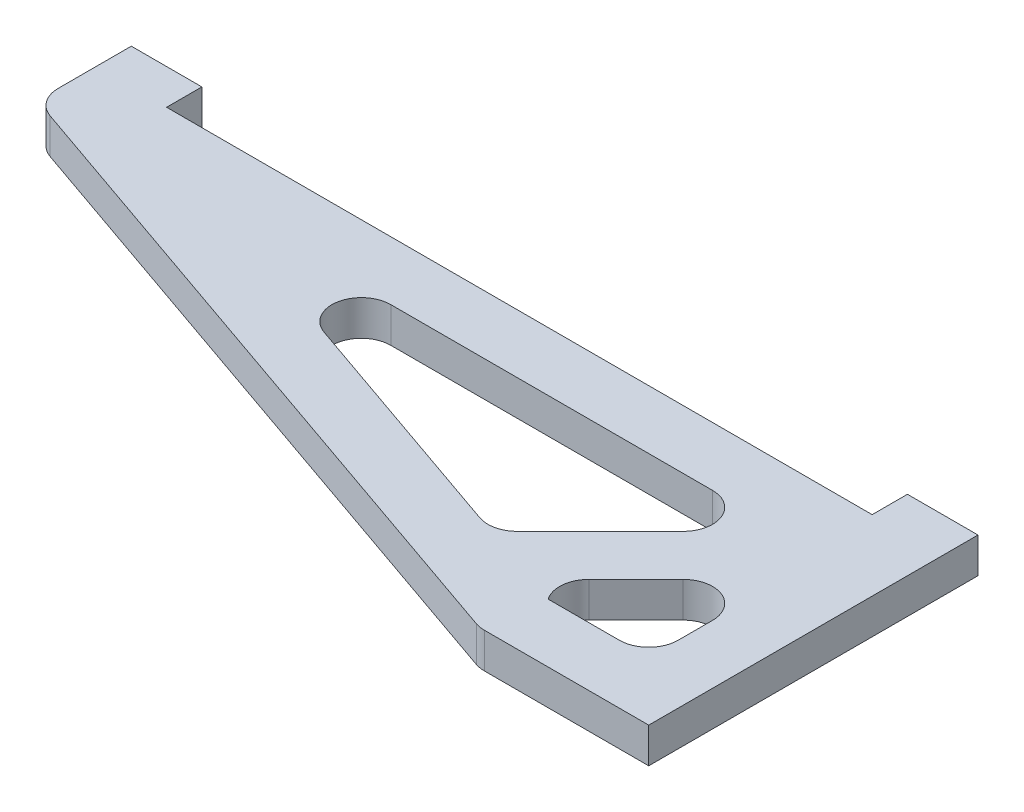
ISO-10303-21;
HEADER;
FILE_DESCRIPTION(('STEP AP214'),'2;1');
FILE_NAME('part.step','',(''),(''),'','','');
FILE_SCHEMA(('AUTOMOTIVE_DESIGN { 1 0 10303 214 1 1 1 1 }'));
ENDSEC;
DATA;
#1=APPLICATION_CONTEXT('core data for automotive mechanical design processes');
#2=APPLICATION_PROTOCOL_DEFINITION('international standard','automotive_design',2000,#1);
#3=PRODUCT_CONTEXT('',#1,'mechanical');
#4=PRODUCT('Part','Part','',(#3));
#5=PRODUCT_RELATED_PRODUCT_CATEGORY('part','',(#4));
#6=PRODUCT_DEFINITION_FORMATION('','',#4);
#7=PRODUCT_DEFINITION_CONTEXT('part definition',#1,'design');
#8=PRODUCT_DEFINITION('design','',#6,#7);
#9=PRODUCT_DEFINITION_SHAPE('','',#8);
#10=(LENGTH_UNIT() NAMED_UNIT(*) SI_UNIT(.MILLI.,.METRE.));
#11=(NAMED_UNIT(*) PLANE_ANGLE_UNIT() SI_UNIT($,.RADIAN.));
#12=(NAMED_UNIT(*) SI_UNIT($,.STERADIAN.) SOLID_ANGLE_UNIT());
#13=UNCERTAINTY_MEASURE_WITH_UNIT(LENGTH_MEASURE(1.E-05),#10,'distance_accuracy_value','');
#14=(GEOMETRIC_REPRESENTATION_CONTEXT(3) GLOBAL_UNCERTAINTY_ASSIGNED_CONTEXT((#13)) GLOBAL_UNIT_ASSIGNED_CONTEXT((#10,
#11,#12)) REPRESENTATION_CONTEXT('',''));
#15=CARTESIAN_POINT('',(0.,0.,0.));
#16=DIRECTION('',(0.,0.,1.));
#17=DIRECTION('',(1.,0.,0.));
#18=AXIS2_PLACEMENT_3D('',#15,#16,#17);
#19=CARTESIAN_POINT('',(36.,3.,0.));
#20=DIRECTION('',(1.,0.,0.));
#21=DIRECTION('',(0.,0.,-1.));
#22=AXIS2_PLACEMENT_3D('',#19,#20,#21);
#23=PLANE('',#22);
#24=DIRECTION('',(0.,0.,1.));
#25=VECTOR('',#24,1.);
#26=CARTESIAN_POINT('',(36.,0.,0.));
#27=LINE('',#26,#25);
#28=CARTESIAN_POINT('',(36.,0.,-15.5));
#29=VERTEX_POINT('',#28);
#30=CARTESIAN_POINT('',(36.,0.,12.5));
#31=VERTEX_POINT('',#30);
#32=EDGE_CURVE('E278',#29,#31,#27,.T.);
#33=ORIENTED_EDGE('',*,*,#32,.F.);
#34=DIRECTION('',(0.,-1.,0.));
#35=VECTOR('',#34,1.);
#36=CARTESIAN_POINT('',(36.,3.,-15.5));
#37=LINE('',#36,#35);
#38=CARTESIAN_POINT('',(36.,3.,-15.5));
#39=VERTEX_POINT('',#38);
#40=EDGE_CURVE('E364',#39,#29,#37,.T.);
#41=ORIENTED_EDGE('',*,*,#40,.F.);
#42=DIRECTION('',(0.,0.,1.));
#43=VECTOR('',#42,1.);
#44=CARTESIAN_POINT('',(36.,3.,0.));
#45=LINE('',#44,#43);
#46=CARTESIAN_POINT('',(36.,3.,12.5));
#47=VERTEX_POINT('',#46);
#48=EDGE_CURVE('E279',#39,#47,#45,.T.);
#49=ORIENTED_EDGE('',*,*,#48,.T.);
#50=DIRECTION('',(0.,-1.,0.));
#51=VECTOR('',#50,1.);
#52=CARTESIAN_POINT('',(36.,3.,12.5));
#53=LINE('',#52,#51);
#54=EDGE_CURVE('E312',#47,#31,#53,.T.);
#55=ORIENTED_EDGE('',*,*,#54,.T.);
#56=EDGE_LOOP('',(#33,#41,#49,#55));
#57=FACE_BOUND('',#56,.T.);
#58=ADVANCED_FACE('F62',(#57),#23,.T.);
#59=CARTESIAN_POINT('',(0.,3.,-15.5));
#60=DIRECTION('',(0.,0.,1.));
#61=DIRECTION('',(1.,0.,0.));
#62=AXIS2_PLACEMENT_3D('',#59,#60,#61);
#63=PLANE('',#62);
#64=DIRECTION('',(-1.,0.,0.));
#65=VECTOR('',#64,1.);
#66=CARTESIAN_POINT('',(0.,0.,-15.5));
#67=LINE('',#66,#65);
#68=CARTESIAN_POINT('',(30.,0.,-15.5));
#69=VERTEX_POINT('',#68);
#70=EDGE_CURVE('E316',#29,#69,#67,.T.);
#71=ORIENTED_EDGE('',*,*,#70,.T.);
#72=DIRECTION('',(0.,-1.,0.));
#73=VECTOR('',#72,1.);
#74=CARTESIAN_POINT('',(30.,3.,-15.5));
#75=LINE('',#74,#73);
#76=CARTESIAN_POINT('',(30.,3.,-15.5));
#77=VERTEX_POINT('',#76);
#78=EDGE_CURVE('E361',#77,#69,#75,.T.);
#79=ORIENTED_EDGE('',*,*,#78,.F.);
#80=DIRECTION('',(-1.,0.,0.));
#81=VECTOR('',#80,1.);
#82=CARTESIAN_POINT('',(0.,3.,-15.5));
#83=LINE('',#82,#81);
#84=EDGE_CURVE('E283',#39,#77,#83,.T.);
#85=ORIENTED_EDGE('',*,*,#84,.F.);
#86=ORIENTED_EDGE('',*,*,#40,.T.);
#87=EDGE_LOOP('',(#71,#79,#85,#86));
#88=FACE_BOUND('',#87,.T.);
#89=ADVANCED_FACE('F487',(#88),#63,.F.);
#90=CARTESIAN_POINT('',(30.,3.,0.));
#91=DIRECTION('',(-1.,0.,0.));
#92=DIRECTION('',(0.,0.,1.));
#93=AXIS2_PLACEMENT_3D('',#90,#91,#92);
#94=PLANE('',#93);
#95=DIRECTION('',(0.,0.,-1.));
#96=VECTOR('',#95,1.);
#97=CARTESIAN_POINT('',(30.,0.,0.));
#98=LINE('',#97,#96);
#99=CARTESIAN_POINT('',(30.,0.,-12.5));
#100=VERTEX_POINT('',#99);
#101=EDGE_CURVE('E320',#100,#69,#98,.T.);
#102=ORIENTED_EDGE('',*,*,#101,.F.);
#103=DIRECTION('',(0.,-1.,0.));
#104=VECTOR('',#103,1.);
#105=CARTESIAN_POINT('',(30.,3.,-12.5));
#106=LINE('',#105,#104);
#107=CARTESIAN_POINT('',(30.,3.,-12.5));
#108=VERTEX_POINT('',#107);
#109=EDGE_CURVE('E358',#108,#100,#106,.T.);
#110=ORIENTED_EDGE('',*,*,#109,.F.);
#111=DIRECTION('',(0.,0.,-1.));
#112=VECTOR('',#111,1.);
#113=CARTESIAN_POINT('',(30.,3.,0.));
#114=LINE('',#113,#112);
#115=EDGE_CURVE('E287',#108,#77,#114,.T.);
#116=ORIENTED_EDGE('',*,*,#115,.T.);
#117=ORIENTED_EDGE('',*,*,#78,.T.);
#118=EDGE_LOOP('',(#102,#110,#116,#117));
#119=FACE_BOUND('',#118,.T.);
#120=ADVANCED_FACE('F493',(#119),#94,.T.);
#121=CARTESIAN_POINT('',(0.,3.,-12.5));
#122=DIRECTION('',(0.,0.,-1.));
#123=DIRECTION('',(-1.,0.,0.));
#124=AXIS2_PLACEMENT_3D('',#121,#122,#123);
#125=PLANE('',#124);
#126=DIRECTION('',(1.,0.,0.));
#127=VECTOR('',#126,1.);
#128=CARTESIAN_POINT('',(0.,0.,-12.5));
#129=LINE('',#128,#127);
#130=CARTESIAN_POINT('',(-30.,0.,-12.5));
#131=VERTEX_POINT('',#130);
#132=EDGE_CURVE('E324',#131,#100,#129,.T.);
#133=ORIENTED_EDGE('',*,*,#132,.F.);
#134=DIRECTION('',(0.,-1.,0.));
#135=VECTOR('',#134,1.);
#136=CARTESIAN_POINT('',(-30.,3.,-12.5));
#137=LINE('',#136,#135);
#138=CARTESIAN_POINT('',(-30.,3.,-12.5));
#139=VERTEX_POINT('',#138);
#140=EDGE_CURVE('E355',#139,#131,#137,.T.);
#141=ORIENTED_EDGE('',*,*,#140,.F.);
#142=DIRECTION('',(1.,0.,0.));
#143=VECTOR('',#142,1.);
#144=CARTESIAN_POINT('',(0.,3.,-12.5));
#145=LINE('',#144,#143);
#146=EDGE_CURVE('E291',#139,#108,#145,.T.);
#147=ORIENTED_EDGE('',*,*,#146,.T.);
#148=ORIENTED_EDGE('',*,*,#109,.T.);
#149=EDGE_LOOP('',(#133,#141,#147,#148));
#150=FACE_BOUND('',#149,.T.);
#151=ADVANCED_FACE('F568',(#150),#125,.T.);
#152=CARTESIAN_POINT('',(-30.,3.,0.));
#153=DIRECTION('',(-1.,0.,0.));
#154=DIRECTION('',(0.,0.,1.));
#155=AXIS2_PLACEMENT_3D('',#152,#153,#154);
#156=PLANE('',#155);
#157=DIRECTION('',(0.,0.,-1.));
#158=VECTOR('',#157,1.);
#159=CARTESIAN_POINT('',(-30.,0.,0.));
#160=LINE('',#159,#158);
#161=CARTESIAN_POINT('',(-30.,0.,-15.5));
#162=VERTEX_POINT('',#161);
#163=EDGE_CURVE('E328',#131,#162,#160,.T.);
#164=ORIENTED_EDGE('',*,*,#163,.T.);
#165=DIRECTION('',(0.,-1.,0.));
#166=VECTOR('',#165,1.);
#167=CARTESIAN_POINT('',(-30.,3.,-15.5));
#168=LINE('',#167,#166);
#169=CARTESIAN_POINT('',(-30.,3.,-15.5));
#170=VERTEX_POINT('',#169);
#171=EDGE_CURVE('E352',#170,#162,#168,.T.);
#172=ORIENTED_EDGE('',*,*,#171,.F.);
#173=DIRECTION('',(0.,0.,-1.));
#174=VECTOR('',#173,1.);
#175=CARTESIAN_POINT('',(-30.,3.,0.));
#176=LINE('',#175,#174);
#177=EDGE_CURVE('E295',#139,#170,#176,.T.);
#178=ORIENTED_EDGE('',*,*,#177,.F.);
#179=ORIENTED_EDGE('',*,*,#140,.T.);
#180=EDGE_LOOP('',(#164,#172,#178,#179));
#181=FACE_BOUND('',#180,.T.);
#182=ADVANCED_FACE('F564',(#181),#156,.F.);
#183=CARTESIAN_POINT('',(0.,3.,-15.5));
#184=DIRECTION('',(0.,0.,-1.));
#185=DIRECTION('',(-1.,0.,0.));
#186=AXIS2_PLACEMENT_3D('',#183,#184,#185);
#187=PLANE('',#186);
#188=DIRECTION('',(1.,0.,0.));
#189=VECTOR('',#188,1.);
#190=CARTESIAN_POINT('',(0.,0.,-15.5));
#191=LINE('',#190,#189);
#192=CARTESIAN_POINT('',(-36.,0.,-15.5));
#193=VERTEX_POINT('',#192);
#194=EDGE_CURVE('E332',#193,#162,#191,.T.);
#195=ORIENTED_EDGE('',*,*,#194,.F.);
#196=DIRECTION('',(0.,-1.,0.));
#197=VECTOR('',#196,1.);
#198=CARTESIAN_POINT('',(-36.,3.,-15.5));
#199=LINE('',#198,#197);
#200=CARTESIAN_POINT('',(-36.,3.,-15.5));
#201=VERTEX_POINT('',#200);
#202=EDGE_CURVE('E349',#201,#193,#199,.T.);
#203=ORIENTED_EDGE('',*,*,#202,.F.);
#204=DIRECTION('',(1.,0.,0.));
#205=VECTOR('',#204,1.);
#206=CARTESIAN_POINT('',(0.,3.,-15.5));
#207=LINE('',#206,#205);
#208=EDGE_CURVE('E298',#201,#170,#207,.T.);
#209=ORIENTED_EDGE('',*,*,#208,.T.);
#210=ORIENTED_EDGE('',*,*,#171,.T.);
#211=EDGE_LOOP('',(#195,#203,#209,#210));
#212=FACE_BOUND('',#211,.T.);
#213=ADVANCED_FACE('F560',(#212),#187,.T.);
#214=CARTESIAN_POINT('',(-36.,3.,0.));
#215=DIRECTION('',(1.,0.,0.));
#216=DIRECTION('',(0.,0.,-1.));
#217=AXIS2_PLACEMENT_3D('',#214,#215,#216);
#218=PLANE('',#217);
#219=DIRECTION('',(0.,0.,1.));
#220=VECTOR('',#219,1.);
#221=CARTESIAN_POINT('',(-36.,0.,0.));
#222=LINE('',#221,#220);
#223=CARTESIAN_POINT('',(-36.,0.,-9.27836097392933));
#224=VERTEX_POINT('',#223);
#225=EDGE_CURVE('E336',#193,#224,#222,.T.);
#226=ORIENTED_EDGE('',*,*,#225,.T.);
#227=DIRECTION('',(0.,-1.,0.));
#228=VECTOR('',#227,1.);
#229=CARTESIAN_POINT('',(-36.,3.,-9.27836097392933));
#230=LINE('',#229,#228);
#231=CARTESIAN_POINT('',(-36.,3.,-9.27836097392933));
#232=VERTEX_POINT('',#231);
#233=EDGE_CURVE('E380',#224,#232,#230,.F.);
#234=ORIENTED_EDGE('',*,*,#233,.T.);
#235=DIRECTION('',(0.,0.,1.));
#236=VECTOR('',#235,1.);
#237=CARTESIAN_POINT('',(-36.,3.,0.));
#238=LINE('',#237,#236);
#239=EDGE_CURVE('E302',#201,#232,#238,.T.);
#240=ORIENTED_EDGE('',*,*,#239,.F.);
#241=ORIENTED_EDGE('',*,*,#202,.T.);
#242=EDGE_LOOP('',(#226,#234,#240,#241));
#243=FACE_BOUND('',#242,.T.);
#244=ADVANCED_FACE('F556',(#243),#218,.F.);
#245=CARTESIAN_POINT('',(-1.5493200206576,3.,4.46204165949389));
#246=DIRECTION('',(0.328011688970412,0.,-0.944673664234786));
#247=DIRECTION('',(-0.944673664234786,0.,-0.328011688970412));
#248=AXIS2_PLACEMENT_3D('',#245,#246,#247);
#249=PLANE('',#248);
#250=DIRECTION('',(0.944673664234786,0.,0.328011688970412));
#251=VECTOR('',#250,1.);
#252=CARTESIAN_POINT('',(-1.5493200206576,3.,4.46204165949389));
#253=LINE('',#252,#251);
#254=CARTESIAN_POINT('',(-34.320029222426,3.,-6.91667681334237));
#255=VERTEX_POINT('',#254);
#256=CARTESIAN_POINT('',(21.2016503824904,3.,12.361684160587));
#257=VERTEX_POINT('',#256);
#258=EDGE_CURVE('E306',#255,#257,#253,.T.);
#259=ORIENTED_EDGE('',*,*,#258,.F.);
#260=DIRECTION('',(0.,-1.,0.));
#261=VECTOR('',#260,1.);
#262=CARTESIAN_POINT('',(-34.320029222426,3.,-6.91667681334237));
#263=LINE('',#262,#261);
#264=CARTESIAN_POINT('',(-34.320029222426,0.,-6.91667681334237));
#265=VERTEX_POINT('',#264);
#266=EDGE_CURVE('E370',#255,#265,#263,.T.);
#267=ORIENTED_EDGE('',*,*,#266,.T.);
#268=DIRECTION('',(0.944673664234786,0.,0.328011688970412));
#269=VECTOR('',#268,1.);
#270=CARTESIAN_POINT('',(-1.5493200206576,0.,4.46204165949389));
#271=LINE('',#270,#269);
#272=CARTESIAN_POINT('',(21.2016503824904,0.,12.361684160587));
#273=VERTEX_POINT('',#272);
#274=EDGE_CURVE('E340',#265,#273,#271,.T.);
#275=ORIENTED_EDGE('',*,*,#274,.T.);
#276=DIRECTION('',(0.,-1.,0.));
#277=VECTOR('',#276,1.);
#278=CARTESIAN_POINT('',(21.2016503824904,3.,12.361684160587));
#279=LINE('',#278,#277);
#280=EDGE_CURVE('E367',#273,#257,#279,.F.);
#281=ORIENTED_EDGE('',*,*,#280,.T.);
#282=EDGE_LOOP('',(#259,#267,#275,#281));
#283=FACE_BOUND('',#282,.T.);
#284=ADVANCED_FACE('F548',(#283),#249,.F.);
#285=CARTESIAN_POINT('',(0.,3.,12.5));
#286=DIRECTION('',(0.,0.,-1.));
#287=DIRECTION('',(-1.,0.,0.));
#288=AXIS2_PLACEMENT_3D('',#285,#286,#287);
#289=PLANE('',#288);
#290=DIRECTION('',(1.,0.,0.));
#291=VECTOR('',#290,1.);
#292=CARTESIAN_POINT('',(0.,3.,12.5));
#293=LINE('',#292,#291);
#294=CARTESIAN_POINT('',(22.0216796049165,3.,12.5));
#295=VERTEX_POINT('',#294);
#296=EDGE_CURVE('E309',#295,#47,#293,.T.);
#297=ORIENTED_EDGE('',*,*,#296,.F.);
#298=DIRECTION('',(0.,-1.,0.));
#299=VECTOR('',#298,1.);
#300=CARTESIAN_POINT('',(22.0216796049165,3.,12.5));
#301=LINE('',#300,#299);
#302=CARTESIAN_POINT('',(22.0216796049165,0.,12.5));
#303=VERTEX_POINT('',#302);
#304=EDGE_CURVE('E388',#295,#303,#301,.T.);
#305=ORIENTED_EDGE('',*,*,#304,.T.);
#306=DIRECTION('',(1.,0.,0.));
#307=VECTOR('',#306,1.);
#308=CARTESIAN_POINT('',(0.,0.,12.5));
#309=LINE('',#308,#307);
#310=EDGE_CURVE('E284',#303,#31,#309,.T.);
#311=ORIENTED_EDGE('',*,*,#310,.T.);
#312=ORIENTED_EDGE('',*,*,#54,.F.);
#313=EDGE_LOOP('',(#297,#305,#311,#312));
#314=FACE_BOUND('',#313,.T.);
#315=ADVANCED_FACE('F541',(#314),#289,.F.);
#316=CARTESIAN_POINT('',(0.,3.,0.));
#317=DIRECTION('',(0.,1.,0.));
#318=DIRECTION('',(0.,0.,1.));
#319=AXIS2_PLACEMENT_3D('',#316,#317,#318);
#320=PLANE('',#319);
#321=DIRECTION('',(1.,0.,0.));
#322=VECTOR('',#321,1.);
#323=CARTESIAN_POINT('',(0.,3.,7.50000000000001));
#324=LINE('',#323,#322);
#325=CARTESIAN_POINT('',(22.443359209833,3.,7.50000000000001));
#326=VERTEX_POINT('',#325);
#327=CARTESIAN_POINT('',(28.5,3.,7.50000000000001));
#328=VERTEX_POINT('',#327);
#329=EDGE_CURVE('E530',#326,#328,#324,.T.);
#330=ORIENTED_EDGE('',*,*,#329,.F.);
#331=CARTESIAN_POINT('',(24.4968960904406,3.,6.07417172142494));
#332=DIRECTION('',(0.,1.,0.));
#333=DIRECTION('',(0.,0.,1.));
#334=AXIS2_PLACEMENT_3D('',#331,#332,#333);
#335=CIRCLE('',#334,2.5);
#336=CARTESIAN_POINT('',(22.7291291374742,3.,4.30640476845857));
#337=VERTEX_POINT('',#336);
#338=EDGE_CURVE('E233',#326,#337,#335,.F.);
#339=ORIENTED_EDGE('',*,*,#338,.T.);
#340=DIRECTION('',(-0.707106781186546,0.,0.707106781186549));
#341=VECTOR('',#340,1.);
#342=CARTESIAN_POINT('',(13.5177669529664,3.,13.5177669529664));
#343=LINE('',#342,#341);
#344=CARTESIAN_POINT('',(26.7322330470336,3.,0.30330085889912));
#345=VERTEX_POINT('',#344);
#346=EDGE_CURVE('E248',#345,#337,#343,.T.);
#347=ORIENTED_EDGE('',*,*,#346,.F.);
#348=CARTESIAN_POINT('',(28.5,3.,2.07106781186548));
#349=DIRECTION('',(0.,1.,0.));
#350=DIRECTION('',(0.,0.,1.));
#351=AXIS2_PLACEMENT_3D('',#348,#349,#350);
#352=CIRCLE('',#351,2.5);
#353=CARTESIAN_POINT('',(31.,3.,2.07106781186548));
#354=VERTEX_POINT('',#353);
#355=EDGE_CURVE('E232',#345,#354,#352,.F.);
#356=ORIENTED_EDGE('',*,*,#355,.T.);
#357=DIRECTION('',(0.,0.,-1.));
#358=VECTOR('',#357,1.);
#359=CARTESIAN_POINT('',(31.,3.,0.));
#360=LINE('',#359,#358);
#361=CARTESIAN_POINT('',(31.,3.,5.00000000000001));
#362=VERTEX_POINT('',#361);
#363=EDGE_CURVE('E252',#362,#354,#360,.T.);
#364=ORIENTED_EDGE('',*,*,#363,.F.);
#365=CARTESIAN_POINT('',(28.5,3.,5.00000000000001));
#366=DIRECTION('',(0.,1.,0.));
#367=DIRECTION('',(0.,0.,1.));
#368=AXIS2_PLACEMENT_3D('',#365,#366,#367);
#369=CIRCLE('',#368,2.5);
#370=EDGE_CURVE('E436',#362,#328,#369,.F.);
#371=ORIENTED_EDGE('',*,*,#370,.T.);
#372=EDGE_LOOP('',(#330,#339,#347,#356,#364,#371));
#373=FACE_BOUND('',#372,.T.);
#374=DIRECTION('',(-1.,0.,0.));
#375=VECTOR('',#374,1.);
#376=CARTESIAN_POINT('',(0.,3.,-7.49999999999999));
#377=LINE('',#376,#375);
#378=CARTESIAN_POINT('',(21.4289321881346,3.,-7.5));
#379=VERTEX_POINT('',#378);
#380=CARTESIAN_POINT('',(-5.93496118525049,3.,-7.49999999999999));
#381=VERTEX_POINT('',#380);
#382=EDGE_CURVE('E263',#379,#381,#377,.T.);
#383=ORIENTED_EDGE('',*,*,#382,.F.);
#384=CARTESIAN_POINT('',(21.4289321881346,3.,-5.));
#385=DIRECTION('',(0.,1.,0.));
#386=DIRECTION('',(0.,0.,1.));
#387=AXIS2_PLACEMENT_3D('',#384,#385,#386);
#388=CIRCLE('',#387,2.5);
#389=CARTESIAN_POINT('',(23.1966991411009,3.,-3.23223304703363));
#390=VERTEX_POINT('',#389);
#391=EDGE_CURVE('E447',#379,#390,#388,.F.);
#392=ORIENTED_EDGE('',*,*,#391,.T.);
#393=DIRECTION('',(0.707106781186546,0.,-0.707106781186549));
#394=VECTOR('',#393,1.);
#395=CARTESIAN_POINT('',(9.98223304703371,3.,9.98223304703366));
#396=LINE('',#395,#394);
#397=CARTESIAN_POINT('',(16.1441493025996,3.,3.82031679146769));
#398=VERTEX_POINT('',#397);
#399=EDGE_CURVE('E270',#398,#390,#396,.T.);
#400=ORIENTED_EDGE('',*,*,#399,.F.);
#401=CARTESIAN_POINT('',(14.3763823496333,3.,2.05254983850133));
#402=DIRECTION('',(0.,1.,0.));
#403=DIRECTION('',(0.,0.,1.));
#404=AXIS2_PLACEMENT_3D('',#401,#402,#403);
#405=CIRCLE('',#404,2.5);
#406=CARTESIAN_POINT('',(13.5563531272072,3.,4.41423399908829));
#407=VERTEX_POINT('',#406);
#408=EDGE_CURVE('E86',#398,#407,#405,.F.);
#409=ORIENTED_EDGE('',*,*,#408,.T.);
#410=DIRECTION('',(0.944673664234786,0.,0.328011688970412));
#411=VECTOR('',#410,1.);
#412=CARTESIAN_POINT('',(0.0907384241944594,3.,-0.261326661680043));
#413=LINE('',#412,#411);
#414=CARTESIAN_POINT('',(-6.75499040767652,3.,-2.63831583941303));
#415=VERTEX_POINT('',#414);
#416=EDGE_CURVE('E267',#415,#407,#413,.T.);
#417=ORIENTED_EDGE('',*,*,#416,.F.);
#418=CARTESIAN_POINT('',(-5.93496118525049,3.,-4.99999999999999));
#419=DIRECTION('',(0.,1.,0.));
#420=DIRECTION('',(0.,0.,1.));
#421=AXIS2_PLACEMENT_3D('',#418,#419,#420);
#422=CIRCLE('',#421,2.5);
#423=EDGE_CURVE('E71',#415,#381,#422,.F.);
#424=ORIENTED_EDGE('',*,*,#423,.T.);
#425=EDGE_LOOP('',(#383,#392,#400,#409,#417,#424));
#426=FACE_BOUND('',#425,.T.);
#427=ORIENTED_EDGE('',*,*,#239,.T.);
#428=CARTESIAN_POINT('',(-33.5,3.,-9.27836097392933));
#429=DIRECTION('',(0.,1.,0.));
#430=DIRECTION('',(0.,0.,1.));
#431=AXIS2_PLACEMENT_3D('',#428,#429,#430);
#432=CIRCLE('',#431,2.5);
#433=EDGE_CURVE('E385',#232,#255,#432,.T.);
#434=ORIENTED_EDGE('',*,*,#433,.T.);
#435=ORIENTED_EDGE('',*,*,#258,.T.);
#436=CARTESIAN_POINT('',(22.0216796049165,3.,10.));
#437=DIRECTION('',(0.,1.,0.));
#438=DIRECTION('',(0.,0.,1.));
#439=AXIS2_PLACEMENT_3D('',#436,#437,#438);
#440=CIRCLE('',#439,2.5);
#441=EDGE_CURVE('E78',#257,#295,#440,.T.);
#442=ORIENTED_EDGE('',*,*,#441,.T.);
#443=ORIENTED_EDGE('',*,*,#296,.T.);
#444=ORIENTED_EDGE('',*,*,#48,.F.);
#445=ORIENTED_EDGE('',*,*,#84,.T.);
#446=ORIENTED_EDGE('',*,*,#115,.F.);
#447=ORIENTED_EDGE('',*,*,#146,.F.);
#448=ORIENTED_EDGE('',*,*,#177,.T.);
#449=ORIENTED_EDGE('',*,*,#208,.F.);
#450=EDGE_LOOP('',(#427,#434,#435,#442,#443,#444,#445,#446,#447,#448,#449));
#451=FACE_BOUND('',#450,.T.);
#452=ADVANCED_FACE('F454',(#373,#426,#451),#320,.T.);
#453=CARTESIAN_POINT('',(0.,0.,0.));
#454=DIRECTION('',(0.,1.,0.));
#455=DIRECTION('',(0.,0.,1.));
#456=AXIS2_PLACEMENT_3D('',#453,#454,#455);
#457=PLANE('',#456);
#458=DIRECTION('',(0.707106781186546,0.,-0.707106781186549));
#459=VECTOR('',#458,1.);
#460=CARTESIAN_POINT('',(13.5177669529664,0.,13.5177669529664));
#461=LINE('',#460,#459);
#462=CARTESIAN_POINT('',(22.7291291374742,0.,4.30640476845857));
#463=VERTEX_POINT('',#462);
#464=CARTESIAN_POINT('',(26.7322330470336,0.,0.30330085889912));
#465=VERTEX_POINT('',#464);
#466=EDGE_CURVE('E227',#463,#465,#461,.T.);
#467=ORIENTED_EDGE('',*,*,#466,.F.);
#468=CARTESIAN_POINT('',(24.4968960904406,0.,6.07417172142494));
#469=DIRECTION('',(0.,1.,0.));
#470=DIRECTION('',(0.,0.,1.));
#471=AXIS2_PLACEMENT_3D('',#468,#469,#470);
#472=CIRCLE('',#471,2.5);
#473=CARTESIAN_POINT('',(22.443359209833,0.,7.50000000000001));
#474=VERTEX_POINT('',#473);
#475=EDGE_CURVE('E220',#463,#474,#472,.T.);
#476=ORIENTED_EDGE('',*,*,#475,.T.);
#477=DIRECTION('',(-1.,0.,0.));
#478=VECTOR('',#477,1.);
#479=CARTESIAN_POINT('',(0.,0.,7.50000000000001));
#480=LINE('',#479,#478);
#481=CARTESIAN_POINT('',(28.5,0.,7.50000000000001));
#482=VERTEX_POINT('',#481);
#483=EDGE_CURVE('E224',#482,#474,#480,.T.);
#484=ORIENTED_EDGE('',*,*,#483,.F.);
#485=CARTESIAN_POINT('',(28.5,0.,5.00000000000001));
#486=DIRECTION('',(0.,1.,0.));
#487=DIRECTION('',(0.,0.,1.));
#488=AXIS2_PLACEMENT_3D('',#485,#486,#487);
#489=CIRCLE('',#488,2.5);
#490=CARTESIAN_POINT('',(31.,0.,5.00000000000001));
#491=VERTEX_POINT('',#490);
#492=EDGE_CURVE('E439',#482,#491,#489,.T.);
#493=ORIENTED_EDGE('',*,*,#492,.T.);
#494=DIRECTION('',(0.,0.,1.));
#495=VECTOR('',#494,1.);
#496=CARTESIAN_POINT('',(31.,0.,0.));
#497=LINE('',#496,#495);
#498=CARTESIAN_POINT('',(31.,0.,2.07106781186548));
#499=VERTEX_POINT('',#498);
#500=EDGE_CURVE('E520',#499,#491,#497,.T.);
#501=ORIENTED_EDGE('',*,*,#500,.F.);
#502=CARTESIAN_POINT('',(28.5,0.,2.07106781186548));
#503=DIRECTION('',(0.,1.,0.));
#504=DIRECTION('',(0.,0.,1.));
#505=AXIS2_PLACEMENT_3D('',#502,#503,#504);
#506=CIRCLE('',#505,2.5);
#507=EDGE_CURVE('E433',#499,#465,#506,.T.);
#508=ORIENTED_EDGE('',*,*,#507,.T.);
#509=EDGE_LOOP('',(#467,#476,#484,#493,#501,#508));
#510=FACE_BOUND('',#509,.T.);
#511=DIRECTION('',(-0.707106781186546,0.,0.707106781186549));
#512=VECTOR('',#511,1.);
#513=CARTESIAN_POINT('',(9.98223304703371,0.,9.98223304703366));
#514=LINE('',#513,#512);
#515=CARTESIAN_POINT('',(23.1966991411009,0.,-3.23223304703363));
#516=VERTEX_POINT('',#515);
#517=CARTESIAN_POINT('',(16.1441493025996,0.,3.82031679146769));
#518=VERTEX_POINT('',#517);
#519=EDGE_CURVE('E244',#516,#518,#514,.T.);
#520=ORIENTED_EDGE('',*,*,#519,.F.);
#521=CARTESIAN_POINT('',(21.4289321881346,0.,-5.));
#522=DIRECTION('',(0.,1.,0.));
#523=DIRECTION('',(0.,0.,1.));
#524=AXIS2_PLACEMENT_3D('',#521,#522,#523);
#525=CIRCLE('',#524,2.5);
#526=CARTESIAN_POINT('',(21.4289321881346,0.,-7.5));
#527=VERTEX_POINT('',#526);
#528=EDGE_CURVE('E450',#516,#527,#525,.T.);
#529=ORIENTED_EDGE('',*,*,#528,.T.);
#530=DIRECTION('',(1.,0.,0.));
#531=VECTOR('',#530,1.);
#532=CARTESIAN_POINT('',(0.,0.,-7.49999999999999));
#533=LINE('',#532,#531);
#534=CARTESIAN_POINT('',(-5.93496118525049,0.,-7.49999999999999));
#535=VERTEX_POINT('',#534);
#536=EDGE_CURVE('E259',#535,#527,#533,.T.);
#537=ORIENTED_EDGE('',*,*,#536,.F.);
#538=CARTESIAN_POINT('',(-5.93496118525049,0.,-4.99999999999999));
#539=DIRECTION('',(0.,1.,0.));
#540=DIRECTION('',(0.,0.,1.));
#541=AXIS2_PLACEMENT_3D('',#538,#539,#540);
#542=CIRCLE('',#541,2.5);
#543=CARTESIAN_POINT('',(-6.75499040767652,0.,-2.63831583941303));
#544=VERTEX_POINT('',#543);
#545=EDGE_CURVE('E12',#535,#544,#542,.T.);
#546=ORIENTED_EDGE('',*,*,#545,.T.);
#547=DIRECTION('',(-0.944673664234786,0.,-0.328011688970412));
#548=VECTOR('',#547,1.);
#549=CARTESIAN_POINT('',(0.0907384241944594,0.,-0.261326661680043));
#550=LINE('',#549,#548);
#551=CARTESIAN_POINT('',(13.5563531272072,0.,4.41423399908829));
#552=VERTEX_POINT('',#551);
#553=EDGE_CURVE('E274',#552,#544,#550,.T.);
#554=ORIENTED_EDGE('',*,*,#553,.F.);
#555=CARTESIAN_POINT('',(14.3763823496333,0.,2.05254983850133));
#556=DIRECTION('',(0.,1.,0.));
#557=DIRECTION('',(0.,0.,1.));
#558=AXIS2_PLACEMENT_3D('',#555,#556,#557);
#559=CIRCLE('',#558,2.5);
#560=EDGE_CURVE('E444',#552,#518,#559,.T.);
#561=ORIENTED_EDGE('',*,*,#560,.T.);
#562=EDGE_LOOP('',(#520,#529,#537,#546,#554,#561));
#563=FACE_BOUND('',#562,.T.);
#564=ORIENTED_EDGE('',*,*,#274,.F.);
#565=CARTESIAN_POINT('',(-33.5,0.,-9.27836097392933));
#566=DIRECTION('',(0.,1.,0.));
#567=DIRECTION('',(0.,0.,1.));
#568=AXIS2_PLACEMENT_3D('',#565,#566,#567);
#569=CIRCLE('',#568,2.5);
#570=EDGE_CURVE('E377',#265,#224,#569,.F.);
#571=ORIENTED_EDGE('',*,*,#570,.T.);
#572=ORIENTED_EDGE('',*,*,#225,.F.);
#573=ORIENTED_EDGE('',*,*,#194,.T.);
#574=ORIENTED_EDGE('',*,*,#163,.F.);
#575=ORIENTED_EDGE('',*,*,#132,.T.);
#576=ORIENTED_EDGE('',*,*,#101,.T.);
#577=ORIENTED_EDGE('',*,*,#70,.F.);
#578=ORIENTED_EDGE('',*,*,#32,.T.);
#579=ORIENTED_EDGE('',*,*,#310,.F.);
#580=CARTESIAN_POINT('',(22.0216796049165,0.,10.));
#581=DIRECTION('',(0.,1.,0.));
#582=DIRECTION('',(0.,0.,1.));
#583=AXIS2_PLACEMENT_3D('',#580,#581,#582);
#584=CIRCLE('',#583,2.5);
#585=EDGE_CURVE('E374',#303,#273,#584,.F.);
#586=ORIENTED_EDGE('',*,*,#585,.T.);
#587=EDGE_LOOP('',(#564,#571,#572,#573,#574,#575,#576,#577,#578,#579,#586));
#588=FACE_BOUND('',#587,.T.);
#589=ADVANCED_FACE('F222',(#510,#563,#588),#457,.F.);
#590=CARTESIAN_POINT('',(0.,-0.00100000000000013,-7.49999999999999));
#591=DIRECTION('',(0.,0.,-1.));
#592=DIRECTION('',(-1.,0.,0.));
#593=AXIS2_PLACEMENT_3D('',#590,#591,#592);
#594=PLANE('',#593);
#595=ORIENTED_EDGE('',*,*,#536,.T.);
#596=DIRECTION('',(0.,1.,0.));
#597=VECTOR('',#596,1.);
#598=CARTESIAN_POINT('',(21.4289321881346,3.,-7.5));
#599=LINE('',#598,#597);
#600=EDGE_CURVE('E425',#527,#379,#599,.T.);
#601=ORIENTED_EDGE('',*,*,#600,.T.);
#602=ORIENTED_EDGE('',*,*,#382,.T.);
#603=DIRECTION('',(0.,1.,0.));
#604=VECTOR('',#603,1.);
#605=CARTESIAN_POINT('',(-5.93496118525049,0.,-7.49999999999999));
#606=LINE('',#605,#604);
#607=EDGE_CURVE('E422',#381,#535,#606,.F.);
#608=ORIENTED_EDGE('',*,*,#607,.T.);
#609=EDGE_LOOP('',(#595,#601,#602,#608));
#610=FACE_BOUND('',#609,.T.);
#611=ADVANCED_FACE('F459',(#610),#594,.F.);
#612=CARTESIAN_POINT('',(9.98223304703371,-0.00100000000000013,9.98223304703366));
#613=DIRECTION('',(0.707106781186549,0.,0.707106781186546));
#614=DIRECTION('',(0.707106781186546,0.,-0.707106781186549));
#615=AXIS2_PLACEMENT_3D('',#612,#613,#614);
#616=PLANE('',#615);
#617=ORIENTED_EDGE('',*,*,#519,.T.);
#618=DIRECTION('',(0.,1.,0.));
#619=VECTOR('',#618,1.);
#620=CARTESIAN_POINT('',(16.1441493025996,3.,3.82031679146769));
#621=LINE('',#620,#619);
#622=EDGE_CURVE('E411',#518,#398,#621,.T.);
#623=ORIENTED_EDGE('',*,*,#622,.T.);
#624=ORIENTED_EDGE('',*,*,#399,.T.);
#625=DIRECTION('',(0.,1.,0.));
#626=VECTOR('',#625,1.);
#627=CARTESIAN_POINT('',(23.1966991411009,0.,-3.23223304703363));
#628=LINE('',#627,#626);
#629=EDGE_CURVE('E408',#390,#516,#628,.F.);
#630=ORIENTED_EDGE('',*,*,#629,.T.);
#631=EDGE_LOOP('',(#617,#623,#624,#630));
#632=FACE_BOUND('',#631,.T.);
#633=ADVANCED_FACE('F475',(#632),#616,.F.);
#634=CARTESIAN_POINT('',(0.0907384241944594,-0.00100000000000013,-0.261326661680043));
#635=DIRECTION('',(-0.328011688970412,0.,0.944673664234786));
#636=DIRECTION('',(0.944673664234786,0.,0.328011688970412));
#637=AXIS2_PLACEMENT_3D('',#634,#635,#636);
#638=PLANE('',#637);
#639=ORIENTED_EDGE('',*,*,#416,.T.);
#640=DIRECTION('',(0.,1.,0.));
#641=VECTOR('',#640,1.);
#642=CARTESIAN_POINT('',(13.5563531272072,0.,4.41423399908829));
#643=LINE('',#642,#641);
#644=EDGE_CURVE('E419',#407,#552,#643,.F.);
#645=ORIENTED_EDGE('',*,*,#644,.T.);
#646=ORIENTED_EDGE('',*,*,#553,.T.);
#647=DIRECTION('',(0.,1.,0.));
#648=VECTOR('',#647,1.);
#649=CARTESIAN_POINT('',(-6.75499040767652,3.,-2.63831583941303));
#650=LINE('',#649,#648);
#651=EDGE_CURVE('E415',#544,#415,#650,.T.);
#652=ORIENTED_EDGE('',*,*,#651,.T.);
#653=EDGE_LOOP('',(#639,#645,#646,#652));
#654=FACE_BOUND('',#653,.T.);
#655=ADVANCED_FACE('F468',(#654),#638,.F.);
#656=CARTESIAN_POINT('',(13.5177669529664,-0.00100000000000013,13.5177669529664));
#657=DIRECTION('',(-0.707106781186549,0.,-0.707106781186546));
#658=DIRECTION('',(-0.707106781186546,0.,0.707106781186549));
#659=AXIS2_PLACEMENT_3D('',#656,#657,#658);
#660=PLANE('',#659);
#661=ORIENTED_EDGE('',*,*,#346,.T.);
#662=DIRECTION('',(0.,1.,0.));
#663=VECTOR('',#662,1.);
#664=CARTESIAN_POINT('',(22.7291291374742,-0.00100000000000013,4.30640476845857));
#665=LINE('',#664,#663);
#666=EDGE_CURVE('E396',#337,#463,#665,.F.);
#667=ORIENTED_EDGE('',*,*,#666,.T.);
#668=ORIENTED_EDGE('',*,*,#466,.T.);
#669=DIRECTION('',(0.,1.,0.));
#670=VECTOR('',#669,1.);
#671=CARTESIAN_POINT('',(26.7322330470336,3.,0.303300858899121));
#672=LINE('',#671,#670);
#673=EDGE_CURVE('E392',#465,#345,#672,.T.);
#674=ORIENTED_EDGE('',*,*,#673,.T.);
#675=EDGE_LOOP('',(#661,#667,#668,#674));
#676=FACE_BOUND('',#675,.T.);
#677=ADVANCED_FACE('F538',(#676),#660,.F.);
#678=CARTESIAN_POINT('',(31.,-0.00100000000000013,0.));
#679=DIRECTION('',(1.,0.,0.));
#680=DIRECTION('',(0.,0.,-1.));
#681=AXIS2_PLACEMENT_3D('',#678,#679,#680);
#682=PLANE('',#681);
#683=ORIENTED_EDGE('',*,*,#363,.T.);
#684=DIRECTION('',(0.,1.,0.));
#685=VECTOR('',#684,1.);
#686=CARTESIAN_POINT('',(31.,0.,2.07106781186548));
#687=LINE('',#686,#685);
#688=EDGE_CURVE('E403',#354,#499,#687,.F.);
#689=ORIENTED_EDGE('',*,*,#688,.T.);
#690=ORIENTED_EDGE('',*,*,#500,.T.);
#691=DIRECTION('',(0.,1.,0.));
#692=VECTOR('',#691,1.);
#693=CARTESIAN_POINT('',(31.,3.,5.00000000000001));
#694=LINE('',#693,#692);
#695=EDGE_CURVE('E399',#491,#362,#694,.T.);
#696=ORIENTED_EDGE('',*,*,#695,.T.);
#697=EDGE_LOOP('',(#683,#689,#690,#696));
#698=FACE_BOUND('',#697,.T.);
#699=ADVANCED_FACE('F524',(#698),#682,.F.);
#700=CARTESIAN_POINT('',(0.,-0.00100000000000013,7.50000000000001));
#701=DIRECTION('',(0.,0.,1.));
#702=DIRECTION('',(1.,0.,0.));
#703=AXIS2_PLACEMENT_3D('',#700,#701,#702);
#704=PLANE('',#703);
#705=ORIENTED_EDGE('',*,*,#329,.T.);
#706=DIRECTION('',(0.,1.,0.));
#707=VECTOR('',#706,1.);
#708=CARTESIAN_POINT('',(28.5,0.,7.50000000000001));
#709=LINE('',#708,#707);
#710=EDGE_CURVE('E242',#328,#482,#709,.F.);
#711=ORIENTED_EDGE('',*,*,#710,.T.);
#712=ORIENTED_EDGE('',*,*,#483,.T.);
#713=DIRECTION('',(0.,1.,0.));
#714=VECTOR('',#713,1.);
#715=CARTESIAN_POINT('',(22.443359209833,-0.00100000000000013,7.50000000000001));
#716=LINE('',#715,#714);
#717=EDGE_CURVE('E239',#474,#326,#716,.T.);
#718=ORIENTED_EDGE('',*,*,#717,.T.);
#719=EDGE_LOOP('',(#705,#711,#712,#718));
#720=FACE_BOUND('',#719,.T.);
#721=ADVANCED_FACE('F238',(#720),#704,.F.);
#722=CARTESIAN_POINT('',(-33.5,3.,-9.27836097392933));
#723=DIRECTION('',(0.,-1.,0.));
#724=DIRECTION('',(0.,0.,-1.));
#725=AXIS2_PLACEMENT_3D('',#722,#723,#724);
#726=CYLINDRICAL_SURFACE('',#725,2.5);
#727=ORIENTED_EDGE('',*,*,#433,.F.);
#728=ORIENTED_EDGE('',*,*,#233,.F.);
#729=ORIENTED_EDGE('',*,*,#570,.F.);
#730=ORIENTED_EDGE('',*,*,#266,.F.);
#731=EDGE_LOOP('',(#727,#728,#729,#730));
#732=FACE_BOUND('',#731,.T.);
#733=ADVANCED_FACE('F499',(#732),#726,.T.);
#734=CARTESIAN_POINT('',(22.0216796049165,3.,10.));
#735=DIRECTION('',(0.,-1.,0.));
#736=DIRECTION('',(0.,0.,-1.));
#737=AXIS2_PLACEMENT_3D('',#734,#735,#736);
#738=CYLINDRICAL_SURFACE('',#737,2.5);
#739=ORIENTED_EDGE('',*,*,#441,.F.);
#740=ORIENTED_EDGE('',*,*,#280,.F.);
#741=ORIENTED_EDGE('',*,*,#585,.F.);
#742=ORIENTED_EDGE('',*,*,#304,.F.);
#743=EDGE_LOOP('',(#739,#740,#741,#742));
#744=FACE_BOUND('',#743,.T.);
#745=ADVANCED_FACE('F502',(#744),#738,.T.);
#746=CARTESIAN_POINT('',(24.4968960904406,-0.00100000000000013,6.07417172142494));
#747=DIRECTION('',(0.,1.,0.));
#748=DIRECTION('',(0.,0.,1.));
#749=AXIS2_PLACEMENT_3D('',#746,#747,#748);
#750=CYLINDRICAL_SURFACE('',#749,2.5);
#751=ORIENTED_EDGE('',*,*,#475,.F.);
#752=ORIENTED_EDGE('',*,*,#666,.F.);
#753=ORIENTED_EDGE('',*,*,#338,.F.);
#754=ORIENTED_EDGE('',*,*,#717,.F.);
#755=EDGE_LOOP('',(#751,#752,#753,#754));
#756=FACE_BOUND('',#755,.T.);
#757=ADVANCED_FACE('F246',(#756),#750,.F.);
#758=CARTESIAN_POINT('',(28.5,-0.00100000000000013,2.07106781186548));
#759=DIRECTION('',(0.,-1.,0.));
#760=DIRECTION('',(0.,0.,-1.));
#761=AXIS2_PLACEMENT_3D('',#758,#759,#760);
#762=CYLINDRICAL_SURFACE('',#761,2.5);
#763=ORIENTED_EDGE('',*,*,#507,.F.);
#764=ORIENTED_EDGE('',*,*,#688,.F.);
#765=ORIENTED_EDGE('',*,*,#355,.F.);
#766=ORIENTED_EDGE('',*,*,#673,.F.);
#767=EDGE_LOOP('',(#763,#764,#765,#766));
#768=FACE_BOUND('',#767,.T.);
#769=ADVANCED_FACE('F509',(#768),#762,.F.);
#770=CARTESIAN_POINT('',(28.5,-0.00100000000000013,5.00000000000001));
#771=DIRECTION('',(0.,-1.,0.));
#772=DIRECTION('',(0.,0.,-1.));
#773=AXIS2_PLACEMENT_3D('',#770,#771,#772);
#774=CYLINDRICAL_SURFACE('',#773,2.5);
#775=ORIENTED_EDGE('',*,*,#492,.F.);
#776=ORIENTED_EDGE('',*,*,#710,.F.);
#777=ORIENTED_EDGE('',*,*,#370,.F.);
#778=ORIENTED_EDGE('',*,*,#695,.F.);
#779=EDGE_LOOP('',(#775,#776,#777,#778));
#780=FACE_BOUND('',#779,.T.);
#781=ADVANCED_FACE('F484',(#780),#774,.F.);
#782=CARTESIAN_POINT('',(14.3763823496333,-0.00100000000000013,2.05254983850133));
#783=DIRECTION('',(0.,-1.,0.));
#784=DIRECTION('',(0.,0.,-1.));
#785=AXIS2_PLACEMENT_3D('',#782,#783,#784);
#786=CYLINDRICAL_SURFACE('',#785,2.5);
#787=ORIENTED_EDGE('',*,*,#560,.F.);
#788=ORIENTED_EDGE('',*,*,#644,.F.);
#789=ORIENTED_EDGE('',*,*,#408,.F.);
#790=ORIENTED_EDGE('',*,*,#622,.F.);
#791=EDGE_LOOP('',(#787,#788,#789,#790));
#792=FACE_BOUND('',#791,.T.);
#793=ADVANCED_FACE('F471',(#792),#786,.F.);
#794=CARTESIAN_POINT('',(21.4289321881346,-0.00100000000000013,-5.));
#795=DIRECTION('',(0.,-1.,0.));
#796=DIRECTION('',(0.,0.,-1.));
#797=AXIS2_PLACEMENT_3D('',#794,#795,#796);
#798=CYLINDRICAL_SURFACE('',#797,2.5);
#799=ORIENTED_EDGE('',*,*,#528,.F.);
#800=ORIENTED_EDGE('',*,*,#629,.F.);
#801=ORIENTED_EDGE('',*,*,#391,.F.);
#802=ORIENTED_EDGE('',*,*,#600,.F.);
#803=EDGE_LOOP('',(#799,#800,#801,#802));
#804=FACE_BOUND('',#803,.T.);
#805=ADVANCED_FACE('F478',(#804),#798,.F.);
#806=CARTESIAN_POINT('',(-5.93496118525049,-0.00100000000000013,-4.99999999999999));
#807=DIRECTION('',(0.,-1.,0.));
#808=DIRECTION('',(0.,0.,-1.));
#809=AXIS2_PLACEMENT_3D('',#806,#807,#808);
#810=CYLINDRICAL_SURFACE('',#809,2.5);
#811=ORIENTED_EDGE('',*,*,#545,.F.);
#812=ORIENTED_EDGE('',*,*,#607,.F.);
#813=ORIENTED_EDGE('',*,*,#423,.F.);
#814=ORIENTED_EDGE('',*,*,#651,.F.);
#815=EDGE_LOOP('',(#811,#812,#813,#814));
#816=FACE_BOUND('',#815,.T.);
#817=ADVANCED_FACE('F64',(#816),#810,.F.);
#818=CLOSED_SHELL('',(#58,#89,#120,#151,#182,#213,#244,#284,#315,#452,#589,#611,#633,#655,#677,
#699,#721,#733,#745,#757,#769,#781,#793,#805,#817));
#819=MANIFOLD_SOLID_BREP('B2',#818);
#820=ADVANCED_BREP_SHAPE_REPRESENTATION('',(#18,#819),#14);
#821=SHAPE_DEFINITION_REPRESENTATION(#9,#820);
ENDSEC;
END-ISO-10303-21;
